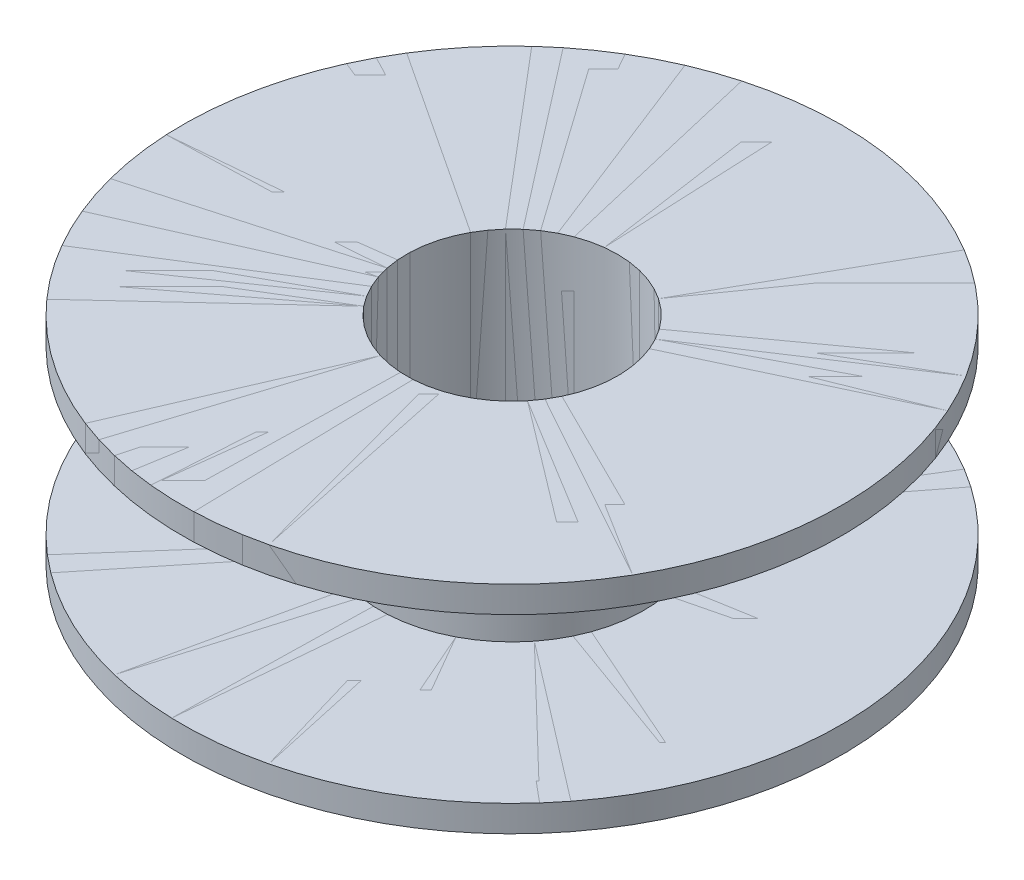
ISO-10303-21;
HEADER;
FILE_DESCRIPTION(('STEP AP214'),'2;1');
FILE_NAME('part.step','',(''),(''),'','','');
FILE_SCHEMA(('AUTOMOTIVE_DESIGN { 1 0 10303 214 1 1 1 1 }'));
ENDSEC;
DATA;
#1=APPLICATION_CONTEXT('core data for automotive mechanical design processes');
#2=APPLICATION_PROTOCOL_DEFINITION('international standard','automotive_design',2000,#1);
#3=PRODUCT_CONTEXT('',#1,'mechanical');
#4=PRODUCT('Part','Part','',(#3));
#5=PRODUCT_RELATED_PRODUCT_CATEGORY('part','',(#4));
#6=PRODUCT_DEFINITION_FORMATION('','',#4);
#7=PRODUCT_DEFINITION_CONTEXT('part definition',#1,'design');
#8=PRODUCT_DEFINITION('design','',#6,#7);
#9=PRODUCT_DEFINITION_SHAPE('','',#8);
#10=(LENGTH_UNIT() NAMED_UNIT(*) SI_UNIT(.MILLI.,.METRE.));
#11=(NAMED_UNIT(*) PLANE_ANGLE_UNIT() SI_UNIT($,.RADIAN.));
#12=(NAMED_UNIT(*) SI_UNIT($,.STERADIAN.) SOLID_ANGLE_UNIT());
#13=UNCERTAINTY_MEASURE_WITH_UNIT(LENGTH_MEASURE(1.E-05),#10,'distance_accuracy_value','');
#14=(GEOMETRIC_REPRESENTATION_CONTEXT(3) GLOBAL_UNCERTAINTY_ASSIGNED_CONTEXT((#13)) GLOBAL_UNIT_ASSIGNED_CONTEXT((#10,
#11,#12)) REPRESENTATION_CONTEXT('',''));
#15=CARTESIAN_POINT('',(0.,0.,0.));
#16=DIRECTION('',(0.,0.,1.));
#17=DIRECTION('',(1.,0.,0.));
#18=AXIS2_PLACEMENT_3D('',#15,#16,#17);
#19=CARTESIAN_POINT('',(4.,8.,0.));
#20=DIRECTION('',(0.,-1.,0.));
#21=DIRECTION('',(0.,0.,-1.));
#22=AXIS2_PLACEMENT_3D('',#19,#20,#21);
#23=PLANE('',#22);
#24=CARTESIAN_POINT('',(0.,8.,0.));
#25=DIRECTION('',(0.,-1.,0.));
#26=DIRECTION('',(0.,0.,-1.));
#27=AXIS2_PLACEMENT_3D('',#24,#25,#26);
#28=CIRCLE('',#27,12.5);
#29=CARTESIAN_POINT('',(0.,8.,-12.5));
#30=VERTEX_POINT('',#29);
#31=EDGE_CURVE('E67',#30,#30,#28,.T.);
#32=ORIENTED_EDGE('',*,*,#31,.T.);
#33=EDGE_LOOP('',(#32));
#34=FACE_BOUND('',#33,.T.);
#35=CARTESIAN_POINT('',(0.,8.,0.));
#36=DIRECTION('',(0.,-1.,0.));
#37=DIRECTION('',(0.,0.,-1.));
#38=AXIS2_PLACEMENT_3D('',#35,#36,#37);
#39=CIRCLE('',#38,4.);
#40=CARTESIAN_POINT('',(0.,8.,-4.));
#41=VERTEX_POINT('',#40);
#42=EDGE_CURVE('E11',#41,#41,#39,.T.);
#43=ORIENTED_EDGE('',*,*,#42,.F.);
#44=EDGE_LOOP('',(#43));
#45=FACE_BOUND('',#44,.T.);
#46=ADVANCED_FACE('F39',(#34,#45),#23,.T.);
#47=CARTESIAN_POINT('',(0.,0.,0.));
#48=DIRECTION('',(0.,-1.,0.));
#49=DIRECTION('',(0.,0.,-1.));
#50=AXIS2_PLACEMENT_3D('',#47,#48,#49);
#51=CYLINDRICAL_SURFACE('',#50,4.);
#52=ORIENTED_EDGE('',*,*,#42,.T.);
#53=EDGE_LOOP('',(#52));
#54=FACE_BOUND('',#53,.T.);
#55=CARTESIAN_POINT('',(0.,16.2,0.));
#56=DIRECTION('',(0.,-1.,0.));
#57=DIRECTION('',(0.,0.,-1.));
#58=AXIS2_PLACEMENT_3D('',#55,#56,#57);
#59=CIRCLE('',#58,4.);
#60=CARTESIAN_POINT('',(0.,16.2,-4.));
#61=VERTEX_POINT('',#60);
#62=EDGE_CURVE('E45',#61,#61,#59,.T.);
#63=ORIENTED_EDGE('',*,*,#62,.F.);
#64=EDGE_LOOP('',(#63));
#65=FACE_BOUND('',#64,.T.);
#66=ADVANCED_FACE('F85',(#54,#65),#51,.F.);
#67=CARTESIAN_POINT('',(4.,16.2,0.));
#68=DIRECTION('',(0.,1.,0.));
#69=DIRECTION('',(0.,0.,1.));
#70=AXIS2_PLACEMENT_3D('',#67,#68,#69);
#71=PLANE('',#70);
#72=ORIENTED_EDGE('',*,*,#62,.T.);
#73=EDGE_LOOP('',(#72));
#74=FACE_BOUND('',#73,.T.);
#75=CARTESIAN_POINT('',(0.,16.2,0.));
#76=DIRECTION('',(0.,-1.,0.));
#77=DIRECTION('',(0.,0.,-1.));
#78=AXIS2_PLACEMENT_3D('',#75,#76,#77);
#79=CIRCLE('',#78,12.5);
#80=CARTESIAN_POINT('',(0.,16.2,-12.5));
#81=VERTEX_POINT('',#80);
#82=EDGE_CURVE('E49',#81,#81,#79,.T.);
#83=ORIENTED_EDGE('',*,*,#82,.F.);
#84=EDGE_LOOP('',(#83));
#85=FACE_BOUND('',#84,.T.);
#86=ADVANCED_FACE('F89',(#74,#85),#71,.T.);
#87=CARTESIAN_POINT('',(0.,0.,0.));
#88=DIRECTION('',(0.,-1.,0.));
#89=DIRECTION('',(0.,0.,-1.));
#90=AXIS2_PLACEMENT_3D('',#87,#88,#89);
#91=CYLINDRICAL_SURFACE('',#90,12.5);
#92=ORIENTED_EDGE('',*,*,#82,.T.);
#93=EDGE_LOOP('',(#92));
#94=FACE_BOUND('',#93,.T.);
#95=CARTESIAN_POINT('',(0.,15.2,0.));
#96=DIRECTION('',(0.,-1.,0.));
#97=DIRECTION('',(0.,0.,-1.));
#98=AXIS2_PLACEMENT_3D('',#95,#96,#97);
#99=CIRCLE('',#98,12.5);
#100=CARTESIAN_POINT('',(0.,15.2,-12.5));
#101=VERTEX_POINT('',#100);
#102=EDGE_CURVE('E53',#101,#101,#99,.T.);
#103=ORIENTED_EDGE('',*,*,#102,.F.);
#104=EDGE_LOOP('',(#103));
#105=FACE_BOUND('',#104,.T.);
#106=ADVANCED_FACE('F93',(#94,#105),#91,.T.);
#107=CARTESIAN_POINT('',(12.5,15.2,0.));
#108=DIRECTION('',(0.,-1.,0.));
#109=DIRECTION('',(0.,0.,-1.));
#110=AXIS2_PLACEMENT_3D('',#107,#108,#109);
#111=PLANE('',#110);
#112=ORIENTED_EDGE('',*,*,#102,.T.);
#113=EDGE_LOOP('',(#112));
#114=FACE_BOUND('',#113,.T.);
#115=CARTESIAN_POINT('',(0.,15.2,0.));
#116=DIRECTION('',(0.,-1.,0.));
#117=DIRECTION('',(0.,0.,-1.));
#118=AXIS2_PLACEMENT_3D('',#115,#116,#117);
#119=CIRCLE('',#118,5.);
#120=CARTESIAN_POINT('',(0.,15.2,-5.));
#121=VERTEX_POINT('',#120);
#122=EDGE_CURVE('E58',#121,#121,#119,.T.);
#123=ORIENTED_EDGE('',*,*,#122,.F.);
#124=EDGE_LOOP('',(#123));
#125=FACE_BOUND('',#124,.T.);
#126=ADVANCED_FACE('F99',(#114,#125),#111,.T.);
#127=CARTESIAN_POINT('',(0.,0.,0.));
#128=DIRECTION('',(0.,-1.,0.));
#129=DIRECTION('',(0.,0.,-1.));
#130=AXIS2_PLACEMENT_3D('',#127,#128,#129);
#131=CYLINDRICAL_SURFACE('',#130,5.);
#132=ORIENTED_EDGE('',*,*,#122,.T.);
#133=EDGE_LOOP('',(#132));
#134=FACE_BOUND('',#133,.T.);
#135=CARTESIAN_POINT('',(0.,9.,0.));
#136=DIRECTION('',(0.,-1.,0.));
#137=DIRECTION('',(0.,0.,-1.));
#138=AXIS2_PLACEMENT_3D('',#135,#136,#137);
#139=CIRCLE('',#138,5.);
#140=CARTESIAN_POINT('',(0.,9.,-5.));
#141=VERTEX_POINT('',#140);
#142=EDGE_CURVE('E61',#141,#141,#139,.T.);
#143=ORIENTED_EDGE('',*,*,#142,.F.);
#144=EDGE_LOOP('',(#143));
#145=FACE_BOUND('',#144,.T.);
#146=ADVANCED_FACE('F81',(#134,#145),#131,.T.);
#147=CARTESIAN_POINT('',(5.,9.,0.));
#148=DIRECTION('',(0.,1.,0.));
#149=DIRECTION('',(0.,0.,1.));
#150=AXIS2_PLACEMENT_3D('',#147,#148,#149);
#151=PLANE('',#150);
#152=ORIENTED_EDGE('',*,*,#142,.T.);
#153=EDGE_LOOP('',(#152));
#154=FACE_BOUND('',#153,.T.);
#155=CARTESIAN_POINT('',(0.,9.,0.));
#156=DIRECTION('',(0.,-1.,0.));
#157=DIRECTION('',(0.,0.,-1.));
#158=AXIS2_PLACEMENT_3D('',#155,#156,#157);
#159=CIRCLE('',#158,12.5);
#160=CARTESIAN_POINT('',(0.,9.,-12.5));
#161=VERTEX_POINT('',#160);
#162=EDGE_CURVE('E64',#161,#161,#159,.T.);
#163=ORIENTED_EDGE('',*,*,#162,.F.);
#164=EDGE_LOOP('',(#163));
#165=FACE_BOUND('',#164,.T.);
#166=ADVANCED_FACE('F75',(#154,#165),#151,.T.);
#167=CARTESIAN_POINT('',(0.,0.,0.));
#168=DIRECTION('',(0.,-1.,0.));
#169=DIRECTION('',(0.,0.,-1.));
#170=AXIS2_PLACEMENT_3D('',#167,#168,#169);
#171=CYLINDRICAL_SURFACE('',#170,12.5);
#172=ORIENTED_EDGE('',*,*,#162,.T.);
#173=EDGE_LOOP('',(#172));
#174=FACE_BOUND('',#173,.T.);
#175=ORIENTED_EDGE('',*,*,#31,.F.);
#176=EDGE_LOOP('',(#175));
#177=FACE_BOUND('',#176,.T.);
#178=ADVANCED_FACE('F73',(#174,#177),#171,.T.);
#179=CLOSED_SHELL('',(#46,#66,#86,#106,#126,#146,#166,#178));
#180=MANIFOLD_SOLID_BREP('B2',#179);
#181=CARTESIAN_POINT('',(0.,0.,0.));
#182=DIRECTION('',(0.,-1.,0.));
#183=DIRECTION('',(0.,0.,-1.));
#184=AXIS2_PLACEMENT_3D('',#181,#182,#183);
#185=CYLINDRICAL_SURFACE('',#184,12.5);
#186=CARTESIAN_POINT('',(0.,8.,0.));
#187=DIRECTION('',(0.,-1.,0.));
#188=DIRECTION('',(0.,0.,-1.));
#189=AXIS2_PLACEMENT_3D('',#186,#187,#188);
#190=CIRCLE('',#189,12.5);
#191=CARTESIAN_POINT('',(0.,8.,-12.5));
#192=VERTEX_POINT('',#191);
#193=EDGE_CURVE('E38',#192,#192,#190,.T.);
#194=ORIENTED_EDGE('',*,*,#193,.F.);
#195=EDGE_LOOP('',(#194));
#196=FACE_BOUND('',#195,.T.);
#197=CARTESIAN_POINT('',(0.,9.,0.));
#198=DIRECTION('',(0.,-1.,0.));
#199=DIRECTION('',(0.,0.,-1.));
#200=AXIS2_PLACEMENT_3D('',#197,#198,#199);
#201=CIRCLE('',#200,12.5);
#202=CARTESIAN_POINT('',(0.,9.,-12.5));
#203=VERTEX_POINT('',#202);
#204=EDGE_CURVE('E189',#203,#203,#201,.T.);
#205=ORIENTED_EDGE('',*,*,#204,.T.);
#206=EDGE_LOOP('',(#205));
#207=FACE_BOUND('',#206,.T.);
#208=ADVANCED_FACE('F161',(#196,#207),#185,.T.);
#209=CARTESIAN_POINT('',(-12.5,8.,0.));
#210=DIRECTION('',(0.,1.,0.));
#211=DIRECTION('',(0.,0.,1.));
#212=AXIS2_PLACEMENT_3D('',#209,#210,#211);
#213=PLANE('',#212);
#214=CARTESIAN_POINT('',(0.,8.,0.));
#215=DIRECTION('',(0.,-1.,0.));
#216=DIRECTION('',(0.,0.,-1.));
#217=AXIS2_PLACEMENT_3D('',#214,#215,#216);
#218=CIRCLE('',#217,4.);
#219=CARTESIAN_POINT('',(0.,8.,-4.));
#220=VERTEX_POINT('',#219);
#221=EDGE_CURVE('E167',#220,#220,#218,.T.);
#222=ORIENTED_EDGE('',*,*,#221,.F.);
#223=EDGE_LOOP('',(#222));
#224=FACE_BOUND('',#223,.T.);
#225=ORIENTED_EDGE('',*,*,#193,.T.);
#226=EDGE_LOOP('',(#225));
#227=FACE_BOUND('',#226,.T.);
#228=ADVANCED_FACE('F226',(#224,#227),#213,.F.);
#229=CARTESIAN_POINT('',(0.,0.,0.));
#230=DIRECTION('',(0.,-1.,0.));
#231=DIRECTION('',(0.,0.,-1.));
#232=AXIS2_PLACEMENT_3D('',#229,#230,#231);
#233=CYLINDRICAL_SURFACE('',#232,4.);
#234=CARTESIAN_POINT('',(0.,16.2,0.));
#235=DIRECTION('',(0.,-1.,0.));
#236=DIRECTION('',(0.,0.,-1.));
#237=AXIS2_PLACEMENT_3D('',#234,#235,#236);
#238=CIRCLE('',#237,4.);
#239=CARTESIAN_POINT('',(0.,16.2,-4.));
#240=VERTEX_POINT('',#239);
#241=EDGE_CURVE('E171',#240,#240,#238,.T.);
#242=ORIENTED_EDGE('',*,*,#241,.F.);
#243=EDGE_LOOP('',(#242));
#244=FACE_BOUND('',#243,.T.);
#245=ORIENTED_EDGE('',*,*,#221,.T.);
#246=EDGE_LOOP('',(#245));
#247=FACE_BOUND('',#246,.T.);
#248=ADVANCED_FACE('F221',(#244,#247),#233,.F.);
#249=CARTESIAN_POINT('',(-12.5,16.2,0.));
#250=DIRECTION('',(0.,-1.,0.));
#251=DIRECTION('',(0.,0.,-1.));
#252=AXIS2_PLACEMENT_3D('',#249,#250,#251);
#253=PLANE('',#252);
#254=CARTESIAN_POINT('',(0.,16.2,0.));
#255=DIRECTION('',(0.,-1.,0.));
#256=DIRECTION('',(0.,0.,-1.));
#257=AXIS2_PLACEMENT_3D('',#254,#255,#256);
#258=CIRCLE('',#257,12.5);
#259=CARTESIAN_POINT('',(0.,16.2,-12.5));
#260=VERTEX_POINT('',#259);
#261=EDGE_CURVE('E175',#260,#260,#258,.T.);
#262=ORIENTED_EDGE('',*,*,#261,.F.);
#263=EDGE_LOOP('',(#262));
#264=FACE_BOUND('',#263,.T.);
#265=ORIENTED_EDGE('',*,*,#241,.T.);
#266=EDGE_LOOP('',(#265));
#267=FACE_BOUND('',#266,.T.);
#268=ADVANCED_FACE('F215',(#264,#267),#253,.F.);
#269=CARTESIAN_POINT('',(0.,0.,0.));
#270=DIRECTION('',(0.,-1.,0.));
#271=DIRECTION('',(0.,0.,-1.));
#272=AXIS2_PLACEMENT_3D('',#269,#270,#271);
#273=CYLINDRICAL_SURFACE('',#272,12.5);
#274=CARTESIAN_POINT('',(0.,15.2,0.));
#275=DIRECTION('',(0.,-1.,0.));
#276=DIRECTION('',(0.,0.,-1.));
#277=AXIS2_PLACEMENT_3D('',#274,#275,#276);
#278=CIRCLE('',#277,12.5);
#279=CARTESIAN_POINT('',(0.,15.2,-12.5));
#280=VERTEX_POINT('',#279);
#281=EDGE_CURVE('E180',#280,#280,#278,.T.);
#282=ORIENTED_EDGE('',*,*,#281,.F.);
#283=EDGE_LOOP('',(#282));
#284=FACE_BOUND('',#283,.T.);
#285=ORIENTED_EDGE('',*,*,#261,.T.);
#286=EDGE_LOOP('',(#285));
#287=FACE_BOUND('',#286,.T.);
#288=ADVANCED_FACE('F209',(#284,#287),#273,.T.);
#289=CARTESIAN_POINT('',(-12.5,15.2,0.));
#290=DIRECTION('',(0.,1.,0.));
#291=DIRECTION('',(0.,0.,1.));
#292=AXIS2_PLACEMENT_3D('',#289,#290,#291);
#293=PLANE('',#292);
#294=CARTESIAN_POINT('',(0.,15.2,0.));
#295=DIRECTION('',(0.,-1.,0.));
#296=DIRECTION('',(0.,0.,-1.));
#297=AXIS2_PLACEMENT_3D('',#294,#295,#296);
#298=CIRCLE('',#297,5.);
#299=CARTESIAN_POINT('',(0.,15.2,-5.));
#300=VERTEX_POINT('',#299);
#301=EDGE_CURVE('E183',#300,#300,#298,.T.);
#302=ORIENTED_EDGE('',*,*,#301,.F.);
#303=EDGE_LOOP('',(#302));
#304=FACE_BOUND('',#303,.T.);
#305=ORIENTED_EDGE('',*,*,#281,.T.);
#306=EDGE_LOOP('',(#305));
#307=FACE_BOUND('',#306,.T.);
#308=ADVANCED_FACE('F203',(#304,#307),#293,.F.);
#309=CARTESIAN_POINT('',(0.,0.,0.));
#310=DIRECTION('',(0.,-1.,0.));
#311=DIRECTION('',(0.,0.,-1.));
#312=AXIS2_PLACEMENT_3D('',#309,#310,#311);
#313=CYLINDRICAL_SURFACE('',#312,5.);
#314=CARTESIAN_POINT('',(0.,9.,0.));
#315=DIRECTION('',(0.,-1.,0.));
#316=DIRECTION('',(0.,0.,-1.));
#317=AXIS2_PLACEMENT_3D('',#314,#315,#316);
#318=CIRCLE('',#317,5.);
#319=CARTESIAN_POINT('',(0.,9.,-5.));
#320=VERTEX_POINT('',#319);
#321=EDGE_CURVE('E186',#320,#320,#318,.T.);
#322=ORIENTED_EDGE('',*,*,#321,.F.);
#323=EDGE_LOOP('',(#322));
#324=FACE_BOUND('',#323,.T.);
#325=ORIENTED_EDGE('',*,*,#301,.T.);
#326=EDGE_LOOP('',(#325));
#327=FACE_BOUND('',#326,.T.);
#328=ADVANCED_FACE('F197',(#324,#327),#313,.T.);
#329=CARTESIAN_POINT('',(-5.,9.,0.));
#330=DIRECTION('',(0.,-1.,0.));
#331=DIRECTION('',(0.,0.,-1.));
#332=AXIS2_PLACEMENT_3D('',#329,#330,#331);
#333=PLANE('',#332);
#334=ORIENTED_EDGE('',*,*,#204,.F.);
#335=EDGE_LOOP('',(#334));
#336=FACE_BOUND('',#335,.T.);
#337=ORIENTED_EDGE('',*,*,#321,.T.);
#338=EDGE_LOOP('',(#337));
#339=FACE_BOUND('',#338,.T.);
#340=ADVANCED_FACE('F194',(#336,#339),#333,.F.);
#341=CLOSED_SHELL('',(#208,#228,#248,#268,#288,#308,#328,#340));
#342=MANIFOLD_SOLID_BREP('B6',#341);
#343=ADVANCED_BREP_SHAPE_REPRESENTATION('',(#18,#180,#342),#14);
#344=SHAPE_DEFINITION_REPRESENTATION(#9,#343);
ENDSEC;
END-ISO-10303-21;
